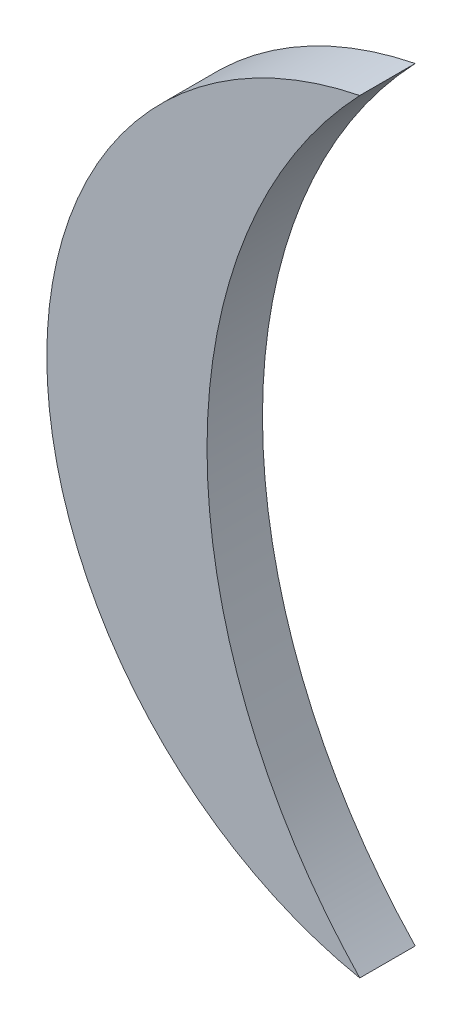
ISO-10303-21;
HEADER;
FILE_DESCRIPTION(('STEP AP214'),'2;1');
FILE_NAME('part.step','',(''),(''),'','','');
FILE_SCHEMA(('AUTOMOTIVE_DESIGN { 1 0 10303 214 1 1 1 1 }'));
ENDSEC;
DATA;
#1=APPLICATION_CONTEXT('core data for automotive mechanical design processes');
#2=APPLICATION_PROTOCOL_DEFINITION('international standard','automotive_design',2000,#1);
#3=PRODUCT_CONTEXT('',#1,'mechanical');
#4=PRODUCT('Part','Part','',(#3));
#5=PRODUCT_RELATED_PRODUCT_CATEGORY('part','',(#4));
#6=PRODUCT_DEFINITION_FORMATION('','',#4);
#7=PRODUCT_DEFINITION_CONTEXT('part definition',#1,'design');
#8=PRODUCT_DEFINITION('design','',#6,#7);
#9=PRODUCT_DEFINITION_SHAPE('','',#8);
#10=(LENGTH_UNIT() NAMED_UNIT(*) SI_UNIT(.MILLI.,.METRE.));
#11=(NAMED_UNIT(*) PLANE_ANGLE_UNIT() SI_UNIT($,.RADIAN.));
#12=(NAMED_UNIT(*) SI_UNIT($,.STERADIAN.) SOLID_ANGLE_UNIT());
#13=UNCERTAINTY_MEASURE_WITH_UNIT(LENGTH_MEASURE(1.E-05),#10,'distance_accuracy_value','');
#14=(GEOMETRIC_REPRESENTATION_CONTEXT(3) GLOBAL_UNCERTAINTY_ASSIGNED_CONTEXT((#13)) GLOBAL_UNIT_ASSIGNED_CONTEXT((#10,
#11,#12)) REPRESENTATION_CONTEXT('',''));
#15=CARTESIAN_POINT('',(0.,0.,0.));
#16=DIRECTION('',(0.,0.,1.));
#17=DIRECTION('',(1.,0.,0.));
#18=AXIS2_PLACEMENT_3D('',#15,#16,#17);
#19=CARTESIAN_POINT('',(62.39999966,104.49999928,0.));
#20=DIRECTION('',(0.,0.,-1.));
#21=DIRECTION('',(1.,0.,0.));
#22=AXIS2_PLACEMENT_3D('',#19,#20,#21);
#23=CYLINDRICAL_SURFACE('',#22,0.3556);
#24=DIRECTION('',(0.,0.,1.));
#25=VECTOR('',#24,1.);
#26=CARTESIAN_POINT('',(62.1423557421785,104.745093081655,0.));
#27=LINE('',#26,#25);
#28=CARTESIAN_POINT('',(62.1423557421785,104.745093081655,0.));
#29=VERTEX_POINT('',#28);
#30=CARTESIAN_POINT('',(62.1423557421785,104.745093081655,0.03556));
#31=VERTEX_POINT('',#30);
#32=EDGE_CURVE('E11',#29,#31,#27,.T.);
#33=ORIENTED_EDGE('',*,*,#32,.T.);
#34=CARTESIAN_POINT('',(62.39999966,104.49999928,0.03556));
#35=DIRECTION('',(0.,0.,1.));
#36=DIRECTION('',(1.,0.,0.));
#37=AXIS2_PLACEMENT_3D('',#34,#35,#36);
#38=CIRCLE('',#37,0.3556);
#39=CARTESIAN_POINT('',(62.1423557421785,104.254905478345,0.03556));
#40=VERTEX_POINT('',#39);
#41=EDGE_CURVE('E24',#31,#40,#38,.T.);
#42=ORIENTED_EDGE('',*,*,#41,.T.);
#43=DIRECTION('',(0.,0.,1.));
#44=VECTOR('',#43,1.);
#45=CARTESIAN_POINT('',(62.1423557421785,104.254905478345,0.));
#46=LINE('',#45,#44);
#47=CARTESIAN_POINT('',(62.1423557421785,104.254905478345,0.));
#48=VERTEX_POINT('',#47);
#49=EDGE_CURVE('E40',#48,#40,#46,.T.);
#50=ORIENTED_EDGE('',*,*,#49,.F.);
#51=CARTESIAN_POINT('',(62.39999966,104.49999928,0.));
#52=DIRECTION('',(0.,0.,1.));
#53=DIRECTION('',(1.,0.,0.));
#54=AXIS2_PLACEMENT_3D('',#51,#52,#53);
#55=CIRCLE('',#54,0.3556);
#56=EDGE_CURVE('E42',#29,#48,#55,.T.);
#57=ORIENTED_EDGE('',*,*,#56,.F.);
#58=EDGE_LOOP('',(#33,#42,#50,#57));
#59=FACE_BOUND('',#58,.T.);
#60=ADVANCED_FACE('F17',(#59),#23,.F.);
#61=CARTESIAN_POINT('',(62.19163838,104.49999928,0.));
#62=DIRECTION('',(0.,0.,-1.));
#63=DIRECTION('',(0.,1.,0.));
#64=AXIS2_PLACEMENT_3D('',#61,#62,#63);
#65=CYLINDRICAL_SURFACE('',#64,0.249999500000001);
#66=CARTESIAN_POINT('',(62.19163838,104.49999928,0.03556));
#67=DIRECTION('',(0.,0.,1.));
#68=DIRECTION('',(0.,1.,0.));
#69=AXIS2_PLACEMENT_3D('',#66,#67,#68);
#70=CIRCLE('',#69,0.249999500000001);
#71=EDGE_CURVE('E49',#31,#40,#70,.T.);
#72=ORIENTED_EDGE('',*,*,#71,.F.);
#73=ORIENTED_EDGE('',*,*,#32,.F.);
#74=CARTESIAN_POINT('',(62.19163838,104.49999928,0.));
#75=DIRECTION('',(0.,0.,1.));
#76=DIRECTION('',(0.,1.,0.));
#77=AXIS2_PLACEMENT_3D('',#74,#75,#76);
#78=CIRCLE('',#77,0.249999500000001);
#79=EDGE_CURVE('E48',#29,#48,#78,.T.);
#80=ORIENTED_EDGE('',*,*,#79,.T.);
#81=ORIENTED_EDGE('',*,*,#49,.T.);
#82=EDGE_LOOP('',(#72,#73,#80,#81));
#83=FACE_BOUND('',#82,.T.);
#84=ADVANCED_FACE('F51',(#83),#65,.T.);
#85=CARTESIAN_POINT('',(62.19163838,104.24999978,0.));
#86=DIRECTION('',(0.,0.,-1.));
#87=DIRECTION('',(-1.,0.,0.));
#88=AXIS2_PLACEMENT_3D('',#85,#86,#87);
#89=PLANE('',#88);
#90=ORIENTED_EDGE('',*,*,#56,.T.);
#91=ORIENTED_EDGE('',*,*,#79,.F.);
#92=EDGE_LOOP('',(#90,#91));
#93=FACE_BOUND('',#92,.T.);
#94=ADVANCED_FACE('F47',(#93),#89,.T.);
#95=CARTESIAN_POINT('',(62.19163838,104.24999978,0.03556));
#96=DIRECTION('',(0.,0.,-1.));
#97=DIRECTION('',(-1.,0.,0.));
#98=AXIS2_PLACEMENT_3D('',#95,#96,#97);
#99=PLANE('',#98);
#100=ORIENTED_EDGE('',*,*,#71,.T.);
#101=ORIENTED_EDGE('',*,*,#41,.F.);
#102=EDGE_LOOP('',(#100,#101));
#103=FACE_BOUND('',#102,.T.);
#104=ADVANCED_FACE('F55',(#103),#99,.F.);
#105=CLOSED_SHELL('',(#60,#84,#94,#104));
#106=MANIFOLD_SOLID_BREP('B1',#105);
#107=ADVANCED_BREP_SHAPE_REPRESENTATION('',(#18,#106),#14);
#108=SHAPE_DEFINITION_REPRESENTATION(#9,#107);
ENDSEC;
END-ISO-10303-21;
